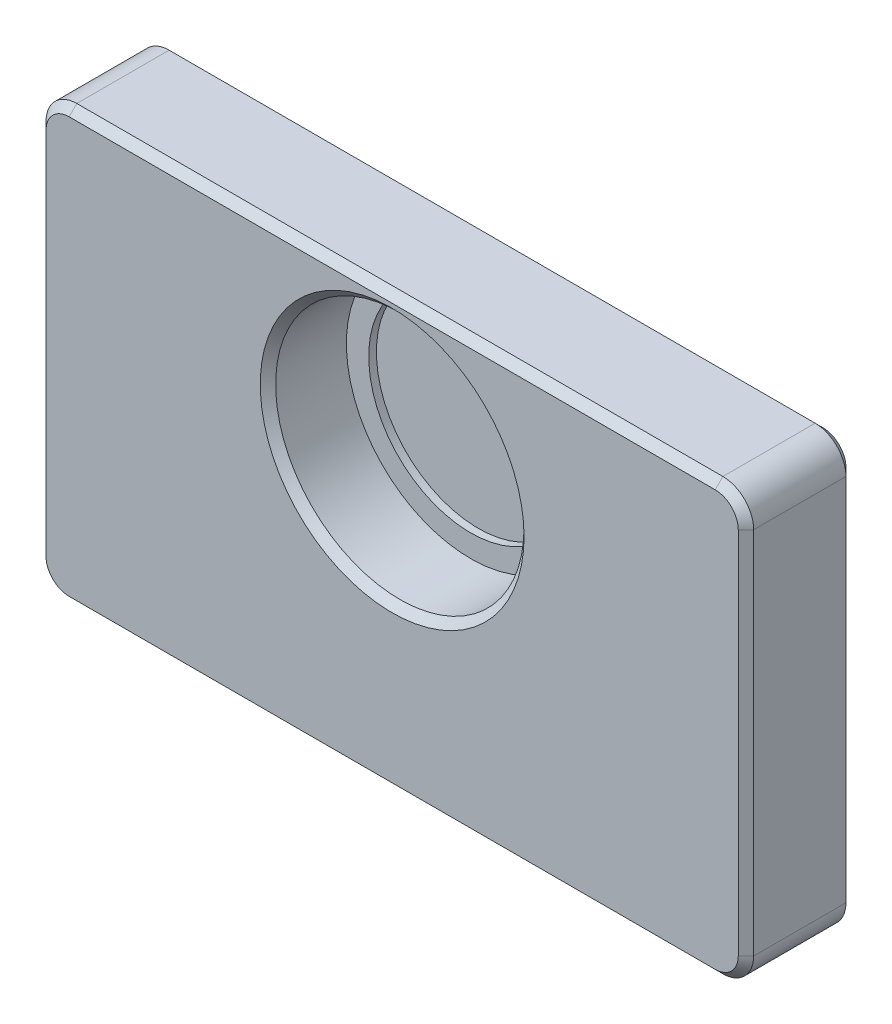
ISO-10303-21;
HEADER;
FILE_DESCRIPTION(('STEP AP214'),'2;1');
FILE_NAME('part.step','',(''),(''),'','','');
FILE_SCHEMA(('AUTOMOTIVE_DESIGN { 1 0 10303 214 1 1 1 1 }'));
ENDSEC;
DATA;
#1=APPLICATION_CONTEXT('core data for automotive mechanical design processes');
#2=APPLICATION_PROTOCOL_DEFINITION('international standard','automotive_design',2000,#1);
#3=PRODUCT_CONTEXT('',#1,'mechanical');
#4=PRODUCT('Part','Part','',(#3));
#5=PRODUCT_RELATED_PRODUCT_CATEGORY('part','',(#4));
#6=PRODUCT_DEFINITION_FORMATION('','',#4);
#7=PRODUCT_DEFINITION_CONTEXT('part definition',#1,'design');
#8=PRODUCT_DEFINITION('design','',#6,#7);
#9=PRODUCT_DEFINITION_SHAPE('','',#8);
#10=(LENGTH_UNIT() NAMED_UNIT(*) SI_UNIT(.MILLI.,.METRE.));
#11=(NAMED_UNIT(*) PLANE_ANGLE_UNIT() SI_UNIT($,.RADIAN.));
#12=(NAMED_UNIT(*) SI_UNIT($,.STERADIAN.) SOLID_ANGLE_UNIT());
#13=UNCERTAINTY_MEASURE_WITH_UNIT(LENGTH_MEASURE(1.E-05),#10,'distance_accuracy_value','');
#14=(GEOMETRIC_REPRESENTATION_CONTEXT(3) GLOBAL_UNCERTAINTY_ASSIGNED_CONTEXT((#13)) GLOBAL_UNIT_ASSIGNED_CONTEXT((#10,
#11,#12)) REPRESENTATION_CONTEXT('',''));
#15=CARTESIAN_POINT('',(0.,0.,0.));
#16=DIRECTION('',(0.,0.,1.));
#17=DIRECTION('',(1.,0.,0.));
#18=AXIS2_PLACEMENT_3D('',#15,#16,#17);
#19=CARTESIAN_POINT('',(23.,-14.,7.));
#20=DIRECTION('',(-1.,0.,0.));
#21=DIRECTION('',(0.,0.,1.));
#22=AXIS2_PLACEMENT_3D('',#19,#20,#21);
#23=PLANE('',#22);
#24=DIRECTION('',(0.,0.,-1.));
#25=VECTOR('',#24,1.);
#26=CARTESIAN_POINT('',(23.,12.,7.));
#27=LINE('',#26,#25);
#28=CARTESIAN_POINT('',(23.,12.,0.5));
#29=VERTEX_POINT('',#28);
#30=CARTESIAN_POINT('',(23.,12.,6.5));
#31=VERTEX_POINT('',#30);
#32=EDGE_CURVE('E316',#29,#31,#27,.F.);
#33=ORIENTED_EDGE('',*,*,#32,.T.);
#34=DIRECTION('',(0.,-1.,0.));
#35=VECTOR('',#34,1.);
#36=CARTESIAN_POINT('',(23.,-12.,6.5));
#37=LINE('',#36,#35);
#38=CARTESIAN_POINT('',(23.,-12.,6.5));
#39=VERTEX_POINT('',#38);
#40=EDGE_CURVE('E236',#31,#39,#37,.T.);
#41=ORIENTED_EDGE('',*,*,#40,.T.);
#42=DIRECTION('',(0.,0.,-1.));
#43=VECTOR('',#42,1.);
#44=CARTESIAN_POINT('',(23.,-12.,7.));
#45=LINE('',#44,#43);
#46=CARTESIAN_POINT('',(23.,-12.,0.5));
#47=VERTEX_POINT('',#46);
#48=EDGE_CURVE('E309',#39,#47,#45,.T.);
#49=ORIENTED_EDGE('',*,*,#48,.T.);
#50=DIRECTION('',(0.,1.,0.));
#51=VECTOR('',#50,1.);
#52=CARTESIAN_POINT('',(23.,-14.,0.5));
#53=LINE('',#52,#51);
#54=EDGE_CURVE('E234',#47,#29,#53,.T.);
#55=ORIENTED_EDGE('',*,*,#54,.T.);
#56=EDGE_LOOP('',(#33,#41,#49,#55));
#57=FACE_BOUND('',#56,.T.);
#58=ADVANCED_FACE('F52',(#57),#23,.F.);
#59=CARTESIAN_POINT('',(23.,14.,7.));
#60=DIRECTION('',(0.,-1.,0.));
#61=DIRECTION('',(1.,0.,0.));
#62=AXIS2_PLACEMENT_3D('',#59,#60,#61);
#63=PLANE('',#62);
#64=DIRECTION('',(0.,0.,-1.));
#65=VECTOR('',#64,1.);
#66=CARTESIAN_POINT('',(-21.,14.,7.));
#67=LINE('',#66,#65);
#68=CARTESIAN_POINT('',(-21.,14.,0.5));
#69=VERTEX_POINT('',#68);
#70=CARTESIAN_POINT('',(-21.,14.,6.5));
#71=VERTEX_POINT('',#70);
#72=EDGE_CURVE('E327',#69,#71,#67,.F.);
#73=ORIENTED_EDGE('',*,*,#72,.T.);
#74=DIRECTION('',(1.,0.,0.));
#75=VECTOR('',#74,1.);
#76=CARTESIAN_POINT('',(21.,14.,6.5));
#77=LINE('',#76,#75);
#78=CARTESIAN_POINT('',(21.,14.,6.5));
#79=VERTEX_POINT('',#78);
#80=EDGE_CURVE('E226',#71,#79,#77,.T.);
#81=ORIENTED_EDGE('',*,*,#80,.T.);
#82=DIRECTION('',(0.,0.,-1.));
#83=VECTOR('',#82,1.);
#84=CARTESIAN_POINT('',(21.,14.,7.));
#85=LINE('',#84,#83);
#86=CARTESIAN_POINT('',(21.,14.,0.5));
#87=VERTEX_POINT('',#86);
#88=EDGE_CURVE('E317',#79,#87,#85,.T.);
#89=ORIENTED_EDGE('',*,*,#88,.T.);
#90=DIRECTION('',(-1.,0.,0.));
#91=VECTOR('',#90,1.);
#92=CARTESIAN_POINT('',(23.,14.,0.5));
#93=LINE('',#92,#91);
#94=EDGE_CURVE('E223',#87,#69,#93,.T.);
#95=ORIENTED_EDGE('',*,*,#94,.T.);
#96=EDGE_LOOP('',(#73,#81,#89,#95));
#97=FACE_BOUND('',#96,.T.);
#98=ADVANCED_FACE('F392',(#97),#63,.F.);
#99=CARTESIAN_POINT('',(-23.,-14.,7.));
#100=DIRECTION('',(1.,0.,0.));
#101=DIRECTION('',(0.,1.,0.));
#102=AXIS2_PLACEMENT_3D('',#99,#100,#101);
#103=PLANE('',#102);
#104=DIRECTION('',(0.,0.,-1.));
#105=VECTOR('',#104,1.);
#106=CARTESIAN_POINT('',(-23.,-12.,7.));
#107=LINE('',#106,#105);
#108=CARTESIAN_POINT('',(-23.,-12.,0.5));
#109=VERTEX_POINT('',#108);
#110=CARTESIAN_POINT('',(-23.,-12.,6.5));
#111=VERTEX_POINT('',#110);
#112=EDGE_CURVE('E335',#109,#111,#107,.F.);
#113=ORIENTED_EDGE('',*,*,#112,.T.);
#114=DIRECTION('',(0.,1.,0.));
#115=VECTOR('',#114,1.);
#116=CARTESIAN_POINT('',(-23.,12.,6.5));
#117=LINE('',#116,#115);
#118=CARTESIAN_POINT('',(-23.,12.,6.5));
#119=VERTEX_POINT('',#118);
#120=EDGE_CURVE('E215',#111,#119,#117,.T.);
#121=ORIENTED_EDGE('',*,*,#120,.T.);
#122=DIRECTION('',(0.,0.,-1.));
#123=VECTOR('',#122,1.);
#124=CARTESIAN_POINT('',(-23.,12.,7.));
#125=LINE('',#124,#123);
#126=CARTESIAN_POINT('',(-23.,12.,0.5));
#127=VERTEX_POINT('',#126);
#128=EDGE_CURVE('E338',#119,#127,#125,.T.);
#129=ORIENTED_EDGE('',*,*,#128,.T.);
#130=DIRECTION('',(0.,-1.,0.));
#131=VECTOR('',#130,1.);
#132=CARTESIAN_POINT('',(-23.,-14.,0.5));
#133=LINE('',#132,#131);
#134=EDGE_CURVE('E213',#127,#109,#133,.T.);
#135=ORIENTED_EDGE('',*,*,#134,.T.);
#136=EDGE_LOOP('',(#113,#121,#129,#135));
#137=FACE_BOUND('',#136,.T.);
#138=ADVANCED_FACE('F427',(#137),#103,.F.);
#139=CARTESIAN_POINT('',(-23.,-14.,7.));
#140=DIRECTION('',(0.,1.,0.));
#141=DIRECTION('',(0.,0.,1.));
#142=AXIS2_PLACEMENT_3D('',#139,#140,#141);
#143=PLANE('',#142);
#144=CARTESIAN_POINT('',(0.,-14.,3.5));
#145=DIRECTION('',(0.,-1.,0.));
#146=DIRECTION('',(0.,0.,-1.));
#147=AXIS2_PLACEMENT_3D('',#144,#145,#146);
#148=CIRCLE('',#147,2.2);
#149=CARTESIAN_POINT('',(0.,-14.,1.3));
#150=VERTEX_POINT('',#149);
#151=EDGE_CURVE('E272',#150,#150,#148,.T.);
#152=ORIENTED_EDGE('',*,*,#151,.F.);
#153=EDGE_LOOP('',(#152));
#154=FACE_BOUND('',#153,.T.);
#155=DIRECTION('',(0.,0.,-1.));
#156=VECTOR('',#155,1.);
#157=CARTESIAN_POINT('',(21.,-14.,7.));
#158=LINE('',#157,#156);
#159=CARTESIAN_POINT('',(21.,-14.,0.5));
#160=VERTEX_POINT('',#159);
#161=CARTESIAN_POINT('',(21.,-14.,6.5));
#162=VERTEX_POINT('',#161);
#163=EDGE_CURVE('E311',#160,#162,#158,.F.);
#164=ORIENTED_EDGE('',*,*,#163,.T.);
#165=DIRECTION('',(-1.,0.,0.));
#166=VECTOR('',#165,1.);
#167=CARTESIAN_POINT('',(-21.,-14.,6.5));
#168=LINE('',#167,#166);
#169=CARTESIAN_POINT('',(-21.,-14.,6.5));
#170=VERTEX_POINT('',#169);
#171=EDGE_CURVE('E206',#162,#170,#168,.T.);
#172=ORIENTED_EDGE('',*,*,#171,.T.);
#173=DIRECTION('',(0.,0.,-1.));
#174=VECTOR('',#173,1.);
#175=CARTESIAN_POINT('',(-21.,-14.,7.));
#176=LINE('',#175,#174);
#177=CARTESIAN_POINT('',(-21.,-14.,0.5));
#178=VERTEX_POINT('',#177);
#179=EDGE_CURVE('E323',#170,#178,#176,.T.);
#180=ORIENTED_EDGE('',*,*,#179,.T.);
#181=DIRECTION('',(1.,0.,0.));
#182=VECTOR('',#181,1.);
#183=CARTESIAN_POINT('',(-23.,-14.,0.5));
#184=LINE('',#183,#182);
#185=EDGE_CURVE('E203',#178,#160,#184,.T.);
#186=ORIENTED_EDGE('',*,*,#185,.T.);
#187=EDGE_LOOP('',(#164,#172,#180,#186));
#188=FACE_BOUND('',#187,.T.);
#189=ADVANCED_FACE('F363',(#154,#188),#143,.F.);
#190=CARTESIAN_POINT('',(0.,0.,7.));
#191=DIRECTION('',(0.,0.,1.));
#192=DIRECTION('',(1.,0.,0.));
#193=AXIS2_PLACEMENT_3D('',#190,#191,#192);
#194=PLANE('',#193);
#195=DIRECTION('',(1.,0.,0.));
#196=VECTOR('',#195,1.);
#197=CARTESIAN_POINT('',(21.,-13.5,7.));
#198=LINE('',#197,#196);
#199=CARTESIAN_POINT('',(-21.,-13.5,7.));
#200=VERTEX_POINT('',#199);
#201=CARTESIAN_POINT('',(21.,-13.5,7.));
#202=VERTEX_POINT('',#201);
#203=EDGE_CURVE('E192',#200,#202,#198,.T.);
#204=ORIENTED_EDGE('',*,*,#203,.T.);
#205=CARTESIAN_POINT('',(21.,-12.,7.));
#206=DIRECTION('',(0.,0.,1.));
#207=DIRECTION('',(1.,0.,0.));
#208=AXIS2_PLACEMENT_3D('',#205,#206,#207);
#209=CIRCLE('',#208,1.50000000000001);
#210=CARTESIAN_POINT('',(22.5,-12.,7.));
#211=VERTEX_POINT('',#210);
#212=EDGE_CURVE('E171',#202,#211,#209,.T.);
#213=ORIENTED_EDGE('',*,*,#212,.T.);
#214=DIRECTION('',(0.,1.,0.));
#215=VECTOR('',#214,1.);
#216=CARTESIAN_POINT('',(22.5,12.,7.));
#217=LINE('',#216,#215);
#218=CARTESIAN_POINT('',(22.5,12.,7.));
#219=VERTEX_POINT('',#218);
#220=EDGE_CURVE('E179',#211,#219,#217,.T.);
#221=ORIENTED_EDGE('',*,*,#220,.T.);
#222=CARTESIAN_POINT('',(21.,12.,7.));
#223=DIRECTION('',(0.,0.,1.));
#224=DIRECTION('',(1.,0.,0.));
#225=AXIS2_PLACEMENT_3D('',#222,#223,#224);
#226=CIRCLE('',#225,1.5);
#227=CARTESIAN_POINT('',(21.,13.5,7.));
#228=VERTEX_POINT('',#227);
#229=EDGE_CURVE('E186',#219,#228,#226,.T.);
#230=ORIENTED_EDGE('',*,*,#229,.T.);
#231=DIRECTION('',(-1.,0.,0.));
#232=VECTOR('',#231,1.);
#233=CARTESIAN_POINT('',(-21.,13.5,7.));
#234=LINE('',#233,#232);
#235=CARTESIAN_POINT('',(-21.,13.5,7.));
#236=VERTEX_POINT('',#235);
#237=EDGE_CURVE('E345',#228,#236,#234,.T.);
#238=ORIENTED_EDGE('',*,*,#237,.T.);
#239=CARTESIAN_POINT('',(-21.,12.,7.));
#240=DIRECTION('',(0.,0.,1.));
#241=DIRECTION('',(1.,0.,0.));
#242=AXIS2_PLACEMENT_3D('',#239,#240,#241);
#243=CIRCLE('',#242,1.5);
#244=CARTESIAN_POINT('',(-22.5,12.,7.));
#245=VERTEX_POINT('',#244);
#246=EDGE_CURVE('E348',#236,#245,#243,.T.);
#247=ORIENTED_EDGE('',*,*,#246,.T.);
#248=DIRECTION('',(0.,-1.,0.));
#249=VECTOR('',#248,1.);
#250=CARTESIAN_POINT('',(-22.5,-12.,7.));
#251=LINE('',#250,#249);
#252=CARTESIAN_POINT('',(-22.5,-12.,7.));
#253=VERTEX_POINT('',#252);
#254=EDGE_CURVE('E350',#245,#253,#251,.T.);
#255=ORIENTED_EDGE('',*,*,#254,.T.);
#256=CARTESIAN_POINT('',(-21.,-12.,7.));
#257=DIRECTION('',(0.,0.,1.));
#258=DIRECTION('',(1.,0.,0.));
#259=AXIS2_PLACEMENT_3D('',#256,#257,#258);
#260=CIRCLE('',#259,1.5);
#261=EDGE_CURVE('E198',#253,#200,#260,.T.);
#262=ORIENTED_EDGE('',*,*,#261,.T.);
#263=EDGE_LOOP('',(#204,#213,#221,#230,#238,#247,#255,#262));
#264=FACE_BOUND('',#263,.T.);
#265=CARTESIAN_POINT('',(0.,4.65,7.));
#266=DIRECTION('',(0.,0.,1.));
#267=DIRECTION('',(1.,0.,0.));
#268=AXIS2_PLACEMENT_3D('',#265,#266,#267);
#269=CIRCLE('',#268,8.575);
#270=CARTESIAN_POINT('',(8.575,4.65,7.));
#271=VERTEX_POINT('',#270);
#272=EDGE_CURVE('E187',#271,#271,#269,.F.);
#273=ORIENTED_EDGE('',*,*,#272,.T.);
#274=EDGE_LOOP('',(#273));
#275=FACE_BOUND('',#274,.T.);
#276=ADVANCED_FACE('F189',(#264,#275),#194,.T.);
#277=CARTESIAN_POINT('',(0.,0.,0.));
#278=DIRECTION('',(0.,0.,1.));
#279=DIRECTION('',(1.,0.,0.));
#280=AXIS2_PLACEMENT_3D('',#277,#278,#279);
#281=PLANE('',#280);
#282=DIRECTION('',(0.,1.,0.));
#283=VECTOR('',#282,1.);
#284=CARTESIAN_POINT('',(-22.5,0.,0.));
#285=LINE('',#284,#283);
#286=CARTESIAN_POINT('',(-22.5,-12.,0.));
#287=VERTEX_POINT('',#286);
#288=CARTESIAN_POINT('',(-22.5,12.,0.));
#289=VERTEX_POINT('',#288);
#290=EDGE_CURVE('E62',#287,#289,#285,.T.);
#291=ORIENTED_EDGE('',*,*,#290,.T.);
#292=CARTESIAN_POINT('',(-21.,12.,0.));
#293=DIRECTION('',(0.,0.,1.));
#294=DIRECTION('',(1.,0.,0.));
#295=AXIS2_PLACEMENT_3D('',#292,#293,#294);
#296=CIRCLE('',#295,1.5);
#297=CARTESIAN_POINT('',(-21.,13.5,0.));
#298=VERTEX_POINT('',#297);
#299=EDGE_CURVE('E13',#289,#298,#296,.F.);
#300=ORIENTED_EDGE('',*,*,#299,.T.);
#301=DIRECTION('',(1.,0.,0.));
#302=VECTOR('',#301,1.);
#303=CARTESIAN_POINT('',(0.,13.5,0.));
#304=LINE('',#303,#302);
#305=CARTESIAN_POINT('',(21.,13.5,0.));
#306=VERTEX_POINT('',#305);
#307=EDGE_CURVE('E241',#298,#306,#304,.T.);
#308=ORIENTED_EDGE('',*,*,#307,.T.);
#309=CARTESIAN_POINT('',(21.,12.,0.));
#310=DIRECTION('',(0.,0.,1.));
#311=DIRECTION('',(1.,0.,0.));
#312=AXIS2_PLACEMENT_3D('',#309,#310,#311);
#313=CIRCLE('',#312,1.5);
#314=CARTESIAN_POINT('',(22.5,12.,0.));
#315=VERTEX_POINT('',#314);
#316=EDGE_CURVE('E244',#306,#315,#313,.F.);
#317=ORIENTED_EDGE('',*,*,#316,.T.);
#318=DIRECTION('',(0.,-1.,0.));
#319=VECTOR('',#318,1.);
#320=CARTESIAN_POINT('',(22.5,0.,0.));
#321=LINE('',#320,#319);
#322=CARTESIAN_POINT('',(22.5,-12.,0.));
#323=VERTEX_POINT('',#322);
#324=EDGE_CURVE('E246',#315,#323,#321,.T.);
#325=ORIENTED_EDGE('',*,*,#324,.T.);
#326=CARTESIAN_POINT('',(21.,-12.,0.));
#327=DIRECTION('',(0.,0.,1.));
#328=DIRECTION('',(1.,0.,0.));
#329=AXIS2_PLACEMENT_3D('',#326,#327,#328);
#330=CIRCLE('',#329,1.5);
#331=CARTESIAN_POINT('',(21.,-13.5,0.));
#332=VERTEX_POINT('',#331);
#333=EDGE_CURVE('E248',#323,#332,#330,.F.);
#334=ORIENTED_EDGE('',*,*,#333,.T.);
#335=DIRECTION('',(-1.,0.,0.));
#336=VECTOR('',#335,1.);
#337=CARTESIAN_POINT('',(0.,-13.5,0.));
#338=LINE('',#337,#336);
#339=CARTESIAN_POINT('',(-21.,-13.5,0.));
#340=VERTEX_POINT('',#339);
#341=EDGE_CURVE('E250',#332,#340,#338,.T.);
#342=ORIENTED_EDGE('',*,*,#341,.T.);
#343=CARTESIAN_POINT('',(-21.,-12.,0.));
#344=DIRECTION('',(0.,0.,1.));
#345=DIRECTION('',(1.,0.,0.));
#346=AXIS2_PLACEMENT_3D('',#343,#344,#345);
#347=CIRCLE('',#346,1.5);
#348=EDGE_CURVE('E73',#340,#287,#347,.F.);
#349=ORIENTED_EDGE('',*,*,#348,.T.);
#350=EDGE_LOOP('',(#291,#300,#308,#317,#325,#334,#342,#349));
#351=FACE_BOUND('',#350,.T.);
#352=ADVANCED_FACE('F379',(#351),#281,.F.);
#353=CARTESIAN_POINT('',(0.,4.65,1.4));
#354=DIRECTION('',(0.,0.,1.));
#355=DIRECTION('',(1.,0.,0.));
#356=AXIS2_PLACEMENT_3D('',#353,#354,#355);
#357=CYLINDRICAL_SURFACE('',#356,8.075);
#358=CARTESIAN_POINT('',(0.,4.65,6.5));
#359=DIRECTION('',(0.,0.,1.));
#360=DIRECTION('',(1.,0.,0.));
#361=AXIS2_PLACEMENT_3D('',#358,#359,#360);
#362=CIRCLE('',#361,8.075);
#363=CARTESIAN_POINT('',(8.075,4.65,6.5));
#364=VERTEX_POINT('',#363);
#365=EDGE_CURVE('E238',#364,#364,#362,.T.);
#366=ORIENTED_EDGE('',*,*,#365,.T.);
#367=EDGE_LOOP('',(#366));
#368=FACE_BOUND('',#367,.T.);
#369=CARTESIAN_POINT('',(0.,4.65,1.9));
#370=DIRECTION('',(0.,0.,1.));
#371=DIRECTION('',(1.,0.,0.));
#372=AXIS2_PLACEMENT_3D('',#369,#370,#371);
#373=CIRCLE('',#372,8.075);
#374=CARTESIAN_POINT('',(8.075,4.65,1.9));
#375=VERTEX_POINT('',#374);
#376=EDGE_CURVE('E402',#375,#375,#373,.T.);
#377=ORIENTED_EDGE('',*,*,#376,.F.);
#378=EDGE_LOOP('',(#377));
#379=FACE_BOUND('',#378,.T.);
#380=ADVANCED_FACE('F635',(#368,#379),#357,.F.);
#381=CARTESIAN_POINT('',(0.,4.65,1.9));
#382=DIRECTION('',(0.,0.,1.));
#383=DIRECTION('',(1.,0.,0.));
#384=AXIS2_PLACEMENT_3D('',#381,#382,#383);
#385=PLANE('',#384);
#386=ORIENTED_EDGE('',*,*,#376,.T.);
#387=EDGE_LOOP('',(#386));
#388=FACE_BOUND('',#387,.T.);
#389=CARTESIAN_POINT('',(0.,4.65,1.9));
#390=DIRECTION('',(0.,0.,1.));
#391=DIRECTION('',(1.,0.,0.));
#392=AXIS2_PLACEMENT_3D('',#389,#390,#391);
#393=CIRCLE('',#392,6.625);
#394=CARTESIAN_POINT('',(6.625,4.65,1.9));
#395=VERTEX_POINT('',#394);
#396=EDGE_CURVE('E407',#395,#395,#393,.T.);
#397=ORIENTED_EDGE('',*,*,#396,.F.);
#398=EDGE_LOOP('',(#397));
#399=FACE_BOUND('',#398,.T.);
#400=ADVANCED_FACE('F627',(#388,#399),#385,.T.);
#401=CARTESIAN_POINT('',(0.,4.65,1.9));
#402=DIRECTION('',(0.,0.,-1.));
#403=DIRECTION('',(-1.,0.,0.));
#404=AXIS2_PLACEMENT_3D('',#401,#402,#403);
#405=CYLINDRICAL_SURFACE('',#404,6.625);
#406=ORIENTED_EDGE('',*,*,#396,.T.);
#407=EDGE_LOOP('',(#406));
#408=FACE_BOUND('',#407,.T.);
#409=CARTESIAN_POINT('',(0.,4.65,1.4));
#410=DIRECTION('',(0.,0.,1.));
#411=DIRECTION('',(1.,0.,0.));
#412=AXIS2_PLACEMENT_3D('',#409,#410,#411);
#413=CIRCLE('',#412,6.625);
#414=CARTESIAN_POINT('',(6.625,4.65,1.4));
#415=VERTEX_POINT('',#414);
#416=EDGE_CURVE('E399',#415,#415,#413,.F.);
#417=ORIENTED_EDGE('',*,*,#416,.T.);
#418=EDGE_LOOP('',(#417));
#419=FACE_BOUND('',#418,.T.);
#420=ADVANCED_FACE('F618',(#408,#419),#405,.F.);
#421=CARTESIAN_POINT('',(0.,4.65,1.4));
#422=DIRECTION('',(0.,0.,1.));
#423=DIRECTION('',(1.,0.,0.));
#424=AXIS2_PLACEMENT_3D('',#421,#422,#423);
#425=PLANE('',#424);
#426=ORIENTED_EDGE('',*,*,#416,.F.);
#427=EDGE_LOOP('',(#426));
#428=FACE_BOUND('',#427,.T.);
#429=ADVANCED_FACE('F446',(#428),#425,.T.);
#430=CARTESIAN_POINT('',(21.,12.,7.));
#431=DIRECTION('',(0.,0.,-1.));
#432=DIRECTION('',(-1.,0.,0.));
#433=AXIS2_PLACEMENT_3D('',#430,#431,#432);
#434=CYLINDRICAL_SURFACE('',#433,2.);
#435=ORIENTED_EDGE('',*,*,#88,.F.);
#436=CARTESIAN_POINT('',(21.,12.,6.5));
#437=DIRECTION('',(0.,0.,1.));
#438=DIRECTION('',(1.,0.,0.));
#439=AXIS2_PLACEMENT_3D('',#436,#437,#438);
#440=CIRCLE('',#439,2.);
#441=EDGE_CURVE('E232',#79,#31,#440,.F.);
#442=ORIENTED_EDGE('',*,*,#441,.T.);
#443=ORIENTED_EDGE('',*,*,#32,.F.);
#444=CARTESIAN_POINT('',(21.,12.,0.5));
#445=DIRECTION('',(0.,0.,1.));
#446=DIRECTION('',(1.,0.,0.));
#447=AXIS2_PLACEMENT_3D('',#444,#445,#446);
#448=CIRCLE('',#447,2.);
#449=EDGE_CURVE('E229',#29,#87,#448,.T.);
#450=ORIENTED_EDGE('',*,*,#449,.T.);
#451=EDGE_LOOP('',(#435,#442,#443,#450));
#452=FACE_BOUND('',#451,.T.);
#453=ADVANCED_FACE('F443',(#452),#434,.T.);
#454=CARTESIAN_POINT('',(21.,-12.,7.));
#455=DIRECTION('',(0.,0.,-1.));
#456=DIRECTION('',(-1.,0.,0.));
#457=AXIS2_PLACEMENT_3D('',#454,#455,#456);
#458=CYLINDRICAL_SURFACE('',#457,2.);
#459=ORIENTED_EDGE('',*,*,#48,.F.);
#460=CARTESIAN_POINT('',(21.,-12.,6.5));
#461=DIRECTION('',(0.,0.,1.));
#462=DIRECTION('',(1.,0.,0.));
#463=AXIS2_PLACEMENT_3D('',#460,#461,#462);
#464=CIRCLE('',#463,2.);
#465=EDGE_CURVE('E173',#39,#162,#464,.F.);
#466=ORIENTED_EDGE('',*,*,#465,.T.);
#467=ORIENTED_EDGE('',*,*,#163,.F.);
#468=CARTESIAN_POINT('',(21.,-12.,0.5));
#469=DIRECTION('',(0.,0.,1.));
#470=DIRECTION('',(1.,0.,0.));
#471=AXIS2_PLACEMENT_3D('',#468,#469,#470);
#472=CIRCLE('',#471,2.);
#473=EDGE_CURVE('E194',#160,#47,#472,.T.);
#474=ORIENTED_EDGE('',*,*,#473,.T.);
#475=EDGE_LOOP('',(#459,#466,#467,#474));
#476=FACE_BOUND('',#475,.T.);
#477=ADVANCED_FACE('F308',(#476),#458,.T.);
#478=CARTESIAN_POINT('',(-21.,12.,7.));
#479=DIRECTION('',(0.,0.,-1.));
#480=DIRECTION('',(-1.,0.,0.));
#481=AXIS2_PLACEMENT_3D('',#478,#479,#480);
#482=CYLINDRICAL_SURFACE('',#481,2.);
#483=ORIENTED_EDGE('',*,*,#128,.F.);
#484=CARTESIAN_POINT('',(-21.,12.,6.5));
#485=DIRECTION('',(0.,0.,1.));
#486=DIRECTION('',(1.,0.,0.));
#487=AXIS2_PLACEMENT_3D('',#484,#485,#486);
#488=CIRCLE('',#487,2.);
#489=EDGE_CURVE('E221',#119,#71,#488,.F.);
#490=ORIENTED_EDGE('',*,*,#489,.T.);
#491=ORIENTED_EDGE('',*,*,#72,.F.);
#492=CARTESIAN_POINT('',(-21.,12.,0.5));
#493=DIRECTION('',(0.,0.,1.));
#494=DIRECTION('',(1.,0.,0.));
#495=AXIS2_PLACEMENT_3D('',#492,#493,#494);
#496=CIRCLE('',#495,2.);
#497=EDGE_CURVE('E218',#69,#127,#496,.T.);
#498=ORIENTED_EDGE('',*,*,#497,.T.);
#499=EDGE_LOOP('',(#483,#490,#491,#498));
#500=FACE_BOUND('',#499,.T.);
#501=ADVANCED_FACE('F397',(#500),#482,.T.);
#502=CARTESIAN_POINT('',(-21.,-12.,7.));
#503=DIRECTION('',(0.,0.,-1.));
#504=DIRECTION('',(-1.,0.,0.));
#505=AXIS2_PLACEMENT_3D('',#502,#503,#504);
#506=CYLINDRICAL_SURFACE('',#505,2.);
#507=ORIENTED_EDGE('',*,*,#179,.F.);
#508=CARTESIAN_POINT('',(-21.,-12.,6.5));
#509=DIRECTION('',(0.,0.,1.));
#510=DIRECTION('',(1.,0.,0.));
#511=AXIS2_PLACEMENT_3D('',#508,#509,#510);
#512=CIRCLE('',#511,2.);
#513=EDGE_CURVE('E211',#170,#111,#512,.F.);
#514=ORIENTED_EDGE('',*,*,#513,.T.);
#515=ORIENTED_EDGE('',*,*,#112,.F.);
#516=CARTESIAN_POINT('',(-21.,-12.,0.5));
#517=DIRECTION('',(0.,0.,1.));
#518=DIRECTION('',(1.,0.,0.));
#519=AXIS2_PLACEMENT_3D('',#516,#517,#518);
#520=CIRCLE('',#519,2.);
#521=EDGE_CURVE('E209',#109,#178,#520,.T.);
#522=ORIENTED_EDGE('',*,*,#521,.T.);
#523=EDGE_LOOP('',(#507,#514,#515,#522));
#524=FACE_BOUND('',#523,.T.);
#525=ADVANCED_FACE('F365',(#524),#506,.T.);
#526=CARTESIAN_POINT('',(0.,-6.,3.5));
#527=DIRECTION('',(0.,-1.,0.));
#528=DIRECTION('',(0.,0.,-1.));
#529=AXIS2_PLACEMENT_3D('',#526,#527,#528);
#530=CYLINDRICAL_SURFACE('',#529,2.2);
#531=CARTESIAN_POINT('',(0.,-6.,3.5));
#532=DIRECTION('',(0.,-1.,0.));
#533=DIRECTION('',(0.,0.,-1.));
#534=AXIS2_PLACEMENT_3D('',#531,#532,#533);
#535=CIRCLE('',#534,2.2);
#536=CARTESIAN_POINT('',(0.,-6.,1.3));
#537=VERTEX_POINT('',#536);
#538=EDGE_CURVE('E410',#537,#537,#535,.T.);
#539=ORIENTED_EDGE('',*,*,#538,.F.);
#540=EDGE_LOOP('',(#539));
#541=FACE_BOUND('',#540,.T.);
#542=ORIENTED_EDGE('',*,*,#151,.T.);
#543=EDGE_LOOP('',(#542));
#544=FACE_BOUND('',#543,.T.);
#545=ADVANCED_FACE('F420',(#541,#544),#530,.F.);
#546=CARTESIAN_POINT('',(0.,-6.,3.5));
#547=DIRECTION('',(0.,-1.,0.));
#548=DIRECTION('',(0.,0.,-1.));
#549=AXIS2_PLACEMENT_3D('',#546,#547,#548);
#550=PLANE('',#549);
#551=ORIENTED_EDGE('',*,*,#538,.T.);
#552=EDGE_LOOP('',(#551));
#553=FACE_BOUND('',#552,.T.);
#554=ADVANCED_FACE('F418',(#553),#550,.T.);
#555=CARTESIAN_POINT('',(-21.,12.,7.));
#556=DIRECTION('',(0.,0.,-1.));
#557=DIRECTION('',(-1.,0.,0.));
#558=AXIS2_PLACEMENT_3D('',#555,#556,#557);
#559=CONICAL_SURFACE('',#558,1.50000000000001,0.785398163397441);
#560=DIRECTION('',(0.,-0.707106781186544,0.707106781186551));
#561=VECTOR('',#560,1.);
#562=CARTESIAN_POINT('',(-21.,14.,6.5));
#563=LINE('',#562,#561);
#564=EDGE_CURVE('E266',#71,#236,#563,.T.);
#565=ORIENTED_EDGE('',*,*,#564,.F.);
#566=ORIENTED_EDGE('',*,*,#489,.F.);
#567=DIRECTION('',(-0.707106781186543,0.,-0.707106781186552));
#568=VECTOR('',#567,1.);
#569=CARTESIAN_POINT('',(-22.5,12.,7.));
#570=LINE('',#569,#568);
#571=EDGE_CURVE('E269',#245,#119,#570,.T.);
#572=ORIENTED_EDGE('',*,*,#571,.F.);
#573=ORIENTED_EDGE('',*,*,#246,.F.);
#574=EDGE_LOOP('',(#565,#566,#572,#573));
#575=FACE_BOUND('',#574,.T.);
#576=ADVANCED_FACE('F497',(#575),#559,.T.);
#577=CARTESIAN_POINT('',(-22.5,0.,7.));
#578=DIRECTION('',(-0.707106781186554,0.,0.707106781186541));
#579=DIRECTION('',(0.,1.,0.));
#580=AXIS2_PLACEMENT_3D('',#577,#578,#579);
#581=PLANE('',#580);
#582=ORIENTED_EDGE('',*,*,#571,.T.);
#583=ORIENTED_EDGE('',*,*,#120,.F.);
#584=DIRECTION('',(-0.707106781186543,0.,-0.707106781186552));
#585=VECTOR('',#584,1.);
#586=CARTESIAN_POINT('',(-22.5,-12.,7.));
#587=LINE('',#586,#585);
#588=EDGE_CURVE('E263',#253,#111,#587,.T.);
#589=ORIENTED_EDGE('',*,*,#588,.F.);
#590=ORIENTED_EDGE('',*,*,#254,.F.);
#591=EDGE_LOOP('',(#582,#583,#589,#590));
#592=FACE_BOUND('',#591,.T.);
#593=ADVANCED_FACE('F490',(#592),#581,.T.);
#594=CARTESIAN_POINT('',(0.,13.5,7.));
#595=DIRECTION('',(0.,0.707106781186552,0.707106781186543));
#596=DIRECTION('',(1.,0.,0.));
#597=AXIS2_PLACEMENT_3D('',#594,#595,#596);
#598=PLANE('',#597);
#599=ORIENTED_EDGE('',*,*,#564,.T.);
#600=ORIENTED_EDGE('',*,*,#237,.F.);
#601=DIRECTION('',(0.,-0.707106781186543,0.707106781186552));
#602=VECTOR('',#601,1.);
#603=CARTESIAN_POINT('',(21.,14.,6.5));
#604=LINE('',#603,#602);
#605=EDGE_CURVE('E260',#79,#228,#604,.T.);
#606=ORIENTED_EDGE('',*,*,#605,.F.);
#607=ORIENTED_EDGE('',*,*,#80,.F.);
#608=EDGE_LOOP('',(#599,#600,#606,#607));
#609=FACE_BOUND('',#608,.T.);
#610=ADVANCED_FACE('F484',(#609),#598,.T.);
#611=CARTESIAN_POINT('',(-21.,-12.,7.));
#612=DIRECTION('',(0.,0.,-1.));
#613=DIRECTION('',(-1.,0.,0.));
#614=AXIS2_PLACEMENT_3D('',#611,#612,#613);
#615=CONICAL_SURFACE('',#614,1.5,0.785398163397443);
#616=ORIENTED_EDGE('',*,*,#588,.T.);
#617=ORIENTED_EDGE('',*,*,#513,.F.);
#618=DIRECTION('',(0.,-0.707106781186544,-0.707106781186551));
#619=VECTOR('',#618,1.);
#620=CARTESIAN_POINT('',(-21.,-13.5,7.));
#621=LINE('',#620,#619);
#622=EDGE_CURVE('E257',#200,#170,#621,.T.);
#623=ORIENTED_EDGE('',*,*,#622,.F.);
#624=ORIENTED_EDGE('',*,*,#261,.F.);
#625=EDGE_LOOP('',(#616,#617,#623,#624));
#626=FACE_BOUND('',#625,.T.);
#627=ADVANCED_FACE('F357',(#626),#615,.T.);
#628=CARTESIAN_POINT('',(21.,12.,7.));
#629=DIRECTION('',(0.,0.,-1.));
#630=DIRECTION('',(-1.,0.,0.));
#631=AXIS2_PLACEMENT_3D('',#628,#629,#630);
#632=CONICAL_SURFACE('',#631,1.5,0.785398163397443);
#633=ORIENTED_EDGE('',*,*,#605,.T.);
#634=ORIENTED_EDGE('',*,*,#229,.F.);
#635=DIRECTION('',(-0.707106781186543,0.,0.707106781186552));
#636=VECTOR('',#635,1.);
#637=CARTESIAN_POINT('',(23.,12.,6.5));
#638=LINE('',#637,#636);
#639=EDGE_CURVE('E182',#31,#219,#638,.T.);
#640=ORIENTED_EDGE('',*,*,#639,.F.);
#641=ORIENTED_EDGE('',*,*,#441,.F.);
#642=EDGE_LOOP('',(#633,#634,#640,#641));
#643=FACE_BOUND('',#642,.T.);
#644=ADVANCED_FACE('F472',(#643),#632,.T.);
#645=CARTESIAN_POINT('',(0.,-13.5,7.));
#646=DIRECTION('',(0.,-0.707106781186552,0.707106781186543));
#647=DIRECTION('',(-1.,0.,0.));
#648=AXIS2_PLACEMENT_3D('',#645,#646,#647);
#649=PLANE('',#648);
#650=ORIENTED_EDGE('',*,*,#622,.T.);
#651=ORIENTED_EDGE('',*,*,#171,.F.);
#652=DIRECTION('',(0.,-0.707106781186543,-0.707106781186552));
#653=VECTOR('',#652,1.);
#654=CARTESIAN_POINT('',(21.,-13.5,7.));
#655=LINE('',#654,#653);
#656=EDGE_CURVE('E176',#202,#162,#655,.T.);
#657=ORIENTED_EDGE('',*,*,#656,.F.);
#658=ORIENTED_EDGE('',*,*,#203,.F.);
#659=EDGE_LOOP('',(#650,#651,#657,#658));
#660=FACE_BOUND('',#659,.T.);
#661=ADVANCED_FACE('F360',(#660),#649,.T.);
#662=CARTESIAN_POINT('',(22.5,0.,7.));
#663=DIRECTION('',(0.707106781186552,0.,0.707106781186543));
#664=DIRECTION('',(0.,-1.,0.));
#665=AXIS2_PLACEMENT_3D('',#662,#663,#664);
#666=PLANE('',#665);
#667=ORIENTED_EDGE('',*,*,#639,.T.);
#668=ORIENTED_EDGE('',*,*,#220,.F.);
#669=DIRECTION('',(-0.707106781186543,0.,0.707106781186552));
#670=VECTOR('',#669,1.);
#671=CARTESIAN_POINT('',(23.,-12.,6.5));
#672=LINE('',#671,#670);
#673=EDGE_CURVE('E167',#39,#211,#672,.T.);
#674=ORIENTED_EDGE('',*,*,#673,.F.);
#675=ORIENTED_EDGE('',*,*,#40,.F.);
#676=EDGE_LOOP('',(#667,#668,#674,#675));
#677=FACE_BOUND('',#676,.T.);
#678=ADVANCED_FACE('F180',(#677),#666,.T.);
#679=CARTESIAN_POINT('',(21.,-12.,7.));
#680=DIRECTION('',(0.,0.,-1.));
#681=DIRECTION('',(-1.,0.,0.));
#682=AXIS2_PLACEMENT_3D('',#679,#680,#681);
#683=CONICAL_SURFACE('',#682,1.50000000000001,0.785398163397441);
#684=ORIENTED_EDGE('',*,*,#656,.T.);
#685=ORIENTED_EDGE('',*,*,#465,.F.);
#686=ORIENTED_EDGE('',*,*,#673,.T.);
#687=ORIENTED_EDGE('',*,*,#212,.F.);
#688=EDGE_LOOP('',(#684,#685,#686,#687));
#689=FACE_BOUND('',#688,.T.);
#690=ADVANCED_FACE('F169',(#689),#683,.T.);
#691=CARTESIAN_POINT('',(0.,4.65,6.5));
#692=DIRECTION('',(0.,0.,1.));
#693=DIRECTION('',(1.,0.,0.));
#694=AXIS2_PLACEMENT_3D('',#691,#692,#693);
#695=CONICAL_SURFACE('',#694,8.075,0.785398163397448);
#696=ORIENTED_EDGE('',*,*,#272,.F.);
#697=EDGE_LOOP('',(#696));
#698=FACE_BOUND('',#697,.T.);
#699=ORIENTED_EDGE('',*,*,#365,.F.);
#700=EDGE_LOOP('',(#699));
#701=FACE_BOUND('',#700,.T.);
#702=ADVANCED_FACE('F461',(#698,#701),#695,.F.);
#703=CARTESIAN_POINT('',(21.,-12.,0.));
#704=DIRECTION('',(0.,0.,1.));
#705=DIRECTION('',(1.,0.,0.));
#706=AXIS2_PLACEMENT_3D('',#703,#704,#705);
#707=CONICAL_SURFACE('',#706,1.5,0.785398163397448);
#708=DIRECTION('',(-0.707106781186547,0.,-0.707106781186547));
#709=VECTOR('',#708,1.);
#710=CARTESIAN_POINT('',(23.,-12.,0.5));
#711=LINE('',#710,#709);
#712=EDGE_CURVE('E288',#47,#323,#711,.T.);
#713=ORIENTED_EDGE('',*,*,#712,.F.);
#714=ORIENTED_EDGE('',*,*,#473,.F.);
#715=DIRECTION('',(0.,-0.707106781186547,0.707106781186547));
#716=VECTOR('',#715,1.);
#717=CARTESIAN_POINT('',(21.,-13.5,0.));
#718=LINE('',#717,#716);
#719=EDGE_CURVE('E57',#332,#160,#718,.T.);
#720=ORIENTED_EDGE('',*,*,#719,.F.);
#721=ORIENTED_EDGE('',*,*,#333,.F.);
#722=EDGE_LOOP('',(#713,#714,#720,#721));
#723=FACE_BOUND('',#722,.T.);
#724=ADVANCED_FACE('F55',(#723),#707,.T.);
#725=CARTESIAN_POINT('',(-23.,-14.,0.5));
#726=DIRECTION('',(0.,0.707106781186547,0.707106781186547));
#727=DIRECTION('',(1.,0.,0.));
#728=AXIS2_PLACEMENT_3D('',#725,#726,#727);
#729=PLANE('',#728);
#730=ORIENTED_EDGE('',*,*,#719,.T.);
#731=ORIENTED_EDGE('',*,*,#185,.F.);
#732=DIRECTION('',(0.,-0.707106781186547,0.707106781186547));
#733=VECTOR('',#732,1.);
#734=CARTESIAN_POINT('',(-21.,-13.5,0.));
#735=LINE('',#734,#733);
#736=EDGE_CURVE('E286',#340,#178,#735,.T.);
#737=ORIENTED_EDGE('',*,*,#736,.F.);
#738=ORIENTED_EDGE('',*,*,#341,.F.);
#739=EDGE_LOOP('',(#730,#731,#737,#738));
#740=FACE_BOUND('',#739,.T.);
#741=ADVANCED_FACE('F299',(#740),#729,.F.);
#742=CARTESIAN_POINT('',(23.,-14.,0.5));
#743=DIRECTION('',(-0.707106781186547,0.,0.707106781186547));
#744=DIRECTION('',(0.,1.,0.));
#745=AXIS2_PLACEMENT_3D('',#742,#743,#744);
#746=PLANE('',#745);
#747=ORIENTED_EDGE('',*,*,#712,.T.);
#748=ORIENTED_EDGE('',*,*,#324,.F.);
#749=DIRECTION('',(-0.707106781186547,0.,-0.707106781186547));
#750=VECTOR('',#749,1.);
#751=CARTESIAN_POINT('',(23.,12.,0.5));
#752=LINE('',#751,#750);
#753=EDGE_CURVE('E283',#29,#315,#752,.T.);
#754=ORIENTED_EDGE('',*,*,#753,.F.);
#755=ORIENTED_EDGE('',*,*,#54,.F.);
#756=EDGE_LOOP('',(#747,#748,#754,#755));
#757=FACE_BOUND('',#756,.T.);
#758=ADVANCED_FACE('F535',(#757),#746,.F.);
#759=CARTESIAN_POINT('',(-21.,-12.,0.));
#760=DIRECTION('',(0.,0.,1.));
#761=DIRECTION('',(1.,0.,0.));
#762=AXIS2_PLACEMENT_3D('',#759,#760,#761);
#763=CONICAL_SURFACE('',#762,1.5,0.78539816339745);
#764=ORIENTED_EDGE('',*,*,#736,.T.);
#765=ORIENTED_EDGE('',*,*,#521,.F.);
#766=DIRECTION('',(-0.707106781186547,0.,0.707106781186547));
#767=VECTOR('',#766,1.);
#768=CARTESIAN_POINT('',(-22.5,-12.,0.));
#769=LINE('',#768,#767);
#770=EDGE_CURVE('E280',#287,#109,#769,.T.);
#771=ORIENTED_EDGE('',*,*,#770,.F.);
#772=ORIENTED_EDGE('',*,*,#348,.F.);
#773=EDGE_LOOP('',(#764,#765,#771,#772));
#774=FACE_BOUND('',#773,.T.);
#775=ADVANCED_FACE('F369',(#774),#763,.T.);
#776=CARTESIAN_POINT('',(21.,12.,0.));
#777=DIRECTION('',(0.,0.,1.));
#778=DIRECTION('',(1.,0.,0.));
#779=AXIS2_PLACEMENT_3D('',#776,#777,#778);
#780=CONICAL_SURFACE('',#779,1.5,0.78539816339745);
#781=ORIENTED_EDGE('',*,*,#753,.T.);
#782=ORIENTED_EDGE('',*,*,#316,.F.);
#783=DIRECTION('',(0.,-0.707106781186549,-0.707106781186546));
#784=VECTOR('',#783,1.);
#785=CARTESIAN_POINT('',(21.,14.,0.5));
#786=LINE('',#785,#784);
#787=EDGE_CURVE('E277',#87,#306,#786,.T.);
#788=ORIENTED_EDGE('',*,*,#787,.F.);
#789=ORIENTED_EDGE('',*,*,#449,.F.);
#790=EDGE_LOOP('',(#781,#782,#788,#789));
#791=FACE_BOUND('',#790,.T.);
#792=ADVANCED_FACE('F384',(#791),#780,.T.);
#793=CARTESIAN_POINT('',(-23.,-14.,0.5));
#794=DIRECTION('',(0.707106781186549,0.,0.707106781186546));
#795=DIRECTION('',(0.,-1.,0.));
#796=AXIS2_PLACEMENT_3D('',#793,#794,#795);
#797=PLANE('',#796);
#798=ORIENTED_EDGE('',*,*,#770,.T.);
#799=ORIENTED_EDGE('',*,*,#134,.F.);
#800=DIRECTION('',(-0.707106781186545,0.,0.70710678118655));
#801=VECTOR('',#800,1.);
#802=CARTESIAN_POINT('',(-22.5,12.,0.));
#803=LINE('',#802,#801);
#804=EDGE_CURVE('E275',#289,#127,#803,.T.);
#805=ORIENTED_EDGE('',*,*,#804,.F.);
#806=ORIENTED_EDGE('',*,*,#290,.F.);
#807=EDGE_LOOP('',(#798,#799,#805,#806));
#808=FACE_BOUND('',#807,.T.);
#809=ADVANCED_FACE('F372',(#808),#797,.F.);
#810=CARTESIAN_POINT('',(23.,14.,0.5));
#811=DIRECTION('',(0.,-0.707106781186547,0.707106781186548));
#812=DIRECTION('',(-1.,0.,0.));
#813=AXIS2_PLACEMENT_3D('',#810,#811,#812);
#814=PLANE('',#813);
#815=ORIENTED_EDGE('',*,*,#787,.T.);
#816=ORIENTED_EDGE('',*,*,#307,.F.);
#817=DIRECTION('',(0.,-0.707106781186549,-0.707106781186546));
#818=VECTOR('',#817,1.);
#819=CARTESIAN_POINT('',(-21.,14.,0.5));
#820=LINE('',#819,#818);
#821=EDGE_CURVE('E273',#69,#298,#820,.T.);
#822=ORIENTED_EDGE('',*,*,#821,.F.);
#823=ORIENTED_EDGE('',*,*,#94,.F.);
#824=EDGE_LOOP('',(#815,#816,#822,#823));
#825=FACE_BOUND('',#824,.T.);
#826=ADVANCED_FACE('F388',(#825),#814,.F.);
#827=CARTESIAN_POINT('',(-21.,12.,0.));
#828=DIRECTION('',(0.,0.,1.));
#829=DIRECTION('',(1.,0.,0.));
#830=AXIS2_PLACEMENT_3D('',#827,#828,#829);
#831=CONICAL_SURFACE('',#830,1.5,0.785398163397448);
#832=ORIENTED_EDGE('',*,*,#804,.T.);
#833=ORIENTED_EDGE('',*,*,#497,.F.);
#834=ORIENTED_EDGE('',*,*,#821,.T.);
#835=ORIENTED_EDGE('',*,*,#299,.F.);
#836=EDGE_LOOP('',(#832,#833,#834,#835));
#837=FACE_BOUND('',#836,.T.);
#838=ADVANCED_FACE('F376',(#837),#831,.T.);
#839=CLOSED_SHELL('',(#58,#98,#138,#189,#276,#352,#380,#400,#420,#429,#453,#477,#501,#525,#545,
#554,#576,#593,#610,#627,#644,#661,#678,#690,#702,#724,#741,#758,#775,#792,#809,#826,#838));
#840=MANIFOLD_SOLID_BREP('B2',#839);
#841=ADVANCED_BREP_SHAPE_REPRESENTATION('',(#18,#840),#14);
#842=SHAPE_DEFINITION_REPRESENTATION(#9,#841);
ENDSEC;
END-ISO-10303-21;
